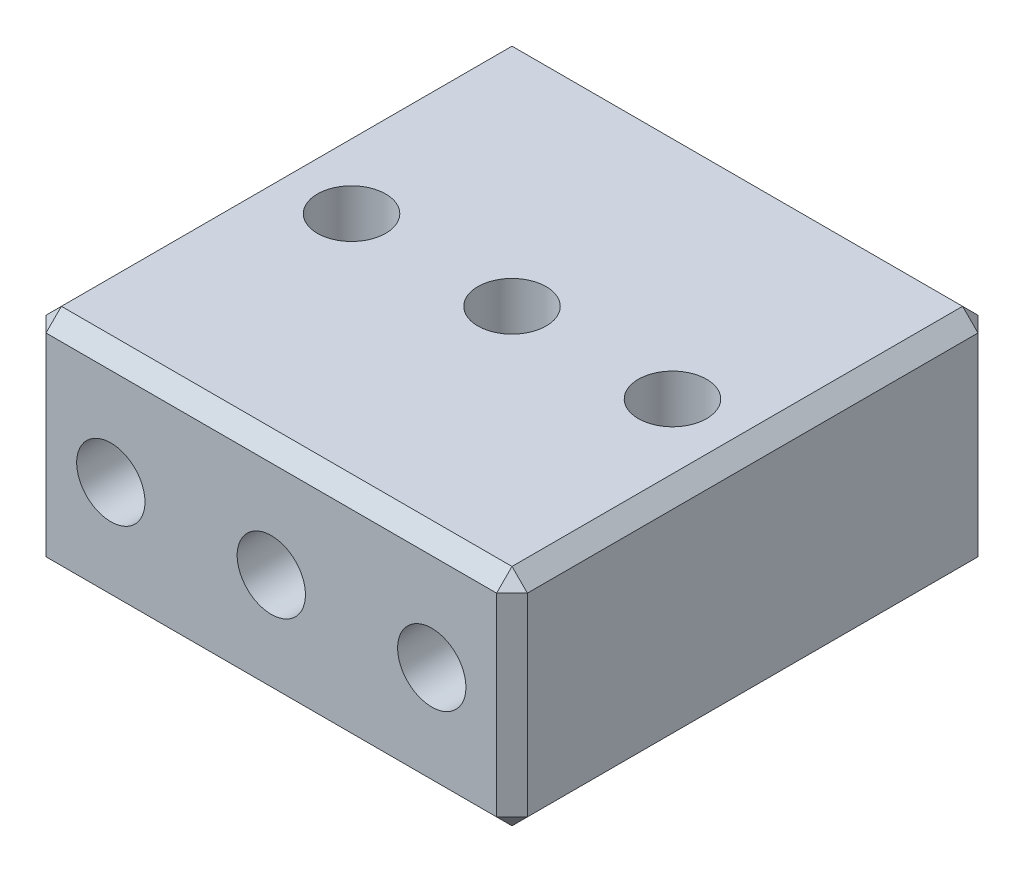
ISO-10303-21;
HEADER;
FILE_DESCRIPTION(('STEP AP214'),'2;1');
FILE_NAME('part.step','',(''),(''),'','','');
FILE_SCHEMA(('AUTOMOTIVE_DESIGN { 1 0 10303 214 1 1 1 1 }'));
ENDSEC;
DATA;
#1=APPLICATION_CONTEXT('core data for automotive mechanical design processes');
#2=APPLICATION_PROTOCOL_DEFINITION('international standard','automotive_design',2000,#1);
#3=PRODUCT_CONTEXT('',#1,'mechanical');
#4=PRODUCT('Part','Part','',(#3));
#5=PRODUCT_RELATED_PRODUCT_CATEGORY('part','',(#4));
#6=PRODUCT_DEFINITION_FORMATION('','',#4);
#7=PRODUCT_DEFINITION_CONTEXT('part definition',#1,'design');
#8=PRODUCT_DEFINITION('design','',#6,#7);
#9=PRODUCT_DEFINITION_SHAPE('','',#8);
#10=(LENGTH_UNIT() NAMED_UNIT(*) SI_UNIT(.MILLI.,.METRE.));
#11=(NAMED_UNIT(*) PLANE_ANGLE_UNIT() SI_UNIT($,.RADIAN.));
#12=(NAMED_UNIT(*) SI_UNIT($,.STERADIAN.) SOLID_ANGLE_UNIT());
#13=UNCERTAINTY_MEASURE_WITH_UNIT(LENGTH_MEASURE(1.E-05),#10,'distance_accuracy_value','');
#14=(GEOMETRIC_REPRESENTATION_CONTEXT(3) GLOBAL_UNCERTAINTY_ASSIGNED_CONTEXT((#13)) GLOBAL_UNIT_ASSIGNED_CONTEXT((#10,
#11,#12)) REPRESENTATION_CONTEXT('',''));
#15=CARTESIAN_POINT('',(0.,0.,0.));
#16=DIRECTION('',(0.,0.,1.));
#17=DIRECTION('',(1.,0.,0.));
#18=AXIS2_PLACEMENT_3D('',#15,#16,#17);
#19=CARTESIAN_POINT('',(-15.875,0.,23.8125));
#20=DIRECTION('',(0.,0.,1.));
#21=DIRECTION('',(1.,0.,0.));
#22=AXIS2_PLACEMENT_3D('',#19,#20,#21);
#23=CYLINDRICAL_SURFACE('',#22,3.3782);
#24=CARTESIAN_POINT('',(-15.875,0.,23.8125));
#25=DIRECTION('',(0.,0.,1.));
#26=DIRECTION('',(1.,0.,0.));
#27=AXIS2_PLACEMENT_3D('',#24,#25,#26);
#28=CIRCLE('',#27,3.3782);
#29=CARTESIAN_POINT('',(-12.4968,0.,23.8125));
#30=VERTEX_POINT('',#29);
#31=EDGE_CURVE('E317',#30,#30,#28,.T.);
#32=ORIENTED_EDGE('',*,*,#31,.T.);
#33=EDGE_LOOP('',(#32));
#34=FACE_BOUND('',#33,.T.);
#35=CARTESIAN_POINT('',(-15.875,0.,0.));
#36=DIRECTION('',(0.,-0.707106781186548,0.707106781186547));
#37=DIRECTION('',(0.,0.707106781186547,0.707106781186547));
#38=AXIS2_PLACEMENT_3D('',#35,#36,#37);
#39=ELLIPSE('',#38,4.77749625640878,3.37819999999999);
#40=CARTESIAN_POINT('',(-19.2532,0.,0.));
#41=VERTEX_POINT('',#40);
#42=CARTESIAN_POINT('',(-12.4968,0.,0.));
#43=VERTEX_POINT('',#42);
#44=EDGE_CURVE('E159',#41,#43,#39,.F.);
#45=ORIENTED_EDGE('',*,*,#44,.T.);
#46=CARTESIAN_POINT('',(-15.875,0.,0.));
#47=DIRECTION('',(0.,0.707106781186547,0.707106781186547));
#48=DIRECTION('',(0.,-0.707106781186548,0.707106781186547));
#49=AXIS2_PLACEMENT_3D('',#46,#47,#48);
#50=ELLIPSE('',#49,4.77749625640878,3.37819999999999);
#51=EDGE_CURVE('E155',#43,#41,#50,.F.);
#52=ORIENTED_EDGE('',*,*,#51,.T.);
#53=EDGE_LOOP('',(#45,#52));
#54=FACE_BOUND('',#53,.T.);
#55=ADVANCED_FACE('F41',(#34,#54),#23,.F.);
#56=CARTESIAN_POINT('',(15.875,0.,23.8125));
#57=DIRECTION('',(0.,0.,1.));
#58=DIRECTION('',(1.,0.,0.));
#59=AXIS2_PLACEMENT_3D('',#56,#57,#58);
#60=CYLINDRICAL_SURFACE('',#59,3.3782);
#61=CARTESIAN_POINT('',(15.875,0.,23.8125));
#62=DIRECTION('',(0.,0.,1.));
#63=DIRECTION('',(1.,0.,0.));
#64=AXIS2_PLACEMENT_3D('',#61,#62,#63);
#65=CIRCLE('',#64,3.3782);
#66=CARTESIAN_POINT('',(19.2532,0.,23.8125));
#67=VERTEX_POINT('',#66);
#68=EDGE_CURVE('E323',#67,#67,#65,.T.);
#69=ORIENTED_EDGE('',*,*,#68,.T.);
#70=EDGE_LOOP('',(#69));
#71=FACE_BOUND('',#70,.T.);
#72=CARTESIAN_POINT('',(15.875,0.,0.));
#73=DIRECTION('',(0.,-0.707106781186548,0.707106781186547));
#74=DIRECTION('',(0.,0.707106781186547,0.707106781186547));
#75=AXIS2_PLACEMENT_3D('',#72,#73,#74);
#76=ELLIPSE('',#75,4.77749625640878,3.37819999999999);
#77=CARTESIAN_POINT('',(12.4968,0.,0.));
#78=VERTEX_POINT('',#77);
#79=CARTESIAN_POINT('',(19.2532,0.,0.));
#80=VERTEX_POINT('',#79);
#81=EDGE_CURVE('E340',#78,#80,#76,.F.);
#82=ORIENTED_EDGE('',*,*,#81,.T.);
#83=CARTESIAN_POINT('',(15.875,0.,0.));
#84=DIRECTION('',(0.,0.707106781186547,0.707106781186547));
#85=DIRECTION('',(0.,-0.707106781186548,0.707106781186547));
#86=AXIS2_PLACEMENT_3D('',#83,#84,#85);
#87=ELLIPSE('',#86,4.77749625640878,3.37819999999999);
#88=EDGE_CURVE('E165',#80,#78,#87,.F.);
#89=ORIENTED_EDGE('',*,*,#88,.T.);
#90=EDGE_LOOP('',(#82,#89));
#91=FACE_BOUND('',#90,.T.);
#92=ADVANCED_FACE('F351',(#71,#91),#60,.F.);
#93=CARTESIAN_POINT('',(0.,0.,23.8125));
#94=DIRECTION('',(0.,0.,1.));
#95=DIRECTION('',(1.,0.,0.));
#96=AXIS2_PLACEMENT_3D('',#93,#94,#95);
#97=CYLINDRICAL_SURFACE('',#96,3.3782);
#98=CARTESIAN_POINT('',(0.,0.,23.8125));
#99=DIRECTION('',(0.,0.,1.));
#100=DIRECTION('',(1.,0.,0.));
#101=AXIS2_PLACEMENT_3D('',#98,#99,#100);
#102=CIRCLE('',#101,3.3782);
#103=CARTESIAN_POINT('',(3.3782,0.,23.8125));
#104=VERTEX_POINT('',#103);
#105=EDGE_CURVE('E311',#104,#104,#102,.T.);
#106=ORIENTED_EDGE('',*,*,#105,.T.);
#107=EDGE_LOOP('',(#106));
#108=FACE_BOUND('',#107,.T.);
#109=CARTESIAN_POINT('',(0.,0.,0.));
#110=DIRECTION('',(0.,-0.707106781186548,0.707106781186547));
#111=DIRECTION('',(0.,0.707106781186547,0.707106781186547));
#112=AXIS2_PLACEMENT_3D('',#109,#110,#111);
#113=ELLIPSE('',#112,4.77749625640878,3.37819999999999);
#114=CARTESIAN_POINT('',(-3.37819999999999,0.,0.));
#115=VERTEX_POINT('',#114);
#116=CARTESIAN_POINT('',(3.37819999999999,0.,0.));
#117=VERTEX_POINT('',#116);
#118=EDGE_CURVE('E329',#115,#117,#113,.F.);
#119=ORIENTED_EDGE('',*,*,#118,.T.);
#120=CARTESIAN_POINT('',(0.,0.,0.));
#121=DIRECTION('',(0.,0.707106781186547,0.707106781186547));
#122=DIRECTION('',(0.,-0.707106781186548,0.707106781186547));
#123=AXIS2_PLACEMENT_3D('',#120,#121,#122);
#124=ELLIPSE('',#123,4.77749625640878,3.37819999999999);
#125=EDGE_CURVE('E337',#117,#115,#124,.F.);
#126=ORIENTED_EDGE('',*,*,#125,.T.);
#127=EDGE_LOOP('',(#119,#126));
#128=FACE_BOUND('',#127,.T.);
#129=ADVANCED_FACE('F380',(#108,#128),#97,.F.);
#130=CARTESIAN_POINT('',(23.8125,-11.1125,23.8125));
#131=DIRECTION('',(0.,0.,-1.));
#132=DIRECTION('',(-1.,0.,0.));
#133=AXIS2_PLACEMENT_3D('',#130,#131,#132);
#134=PLANE('',#133);
#135=DIRECTION('',(-1.,0.,0.));
#136=VECTOR('',#135,1.);
#137=CARTESIAN_POINT('',(23.8125,9.5885,23.8125));
#138=LINE('',#137,#136);
#139=CARTESIAN_POINT('',(22.2885,9.5885,23.8125));
#140=VERTEX_POINT('',#139);
#141=CARTESIAN_POINT('',(-22.2885,9.5885,23.8125));
#142=VERTEX_POINT('',#141);
#143=EDGE_CURVE('E208',#140,#142,#138,.T.);
#144=ORIENTED_EDGE('',*,*,#143,.T.);
#145=DIRECTION('',(0.,-1.,0.));
#146=VECTOR('',#145,1.);
#147=CARTESIAN_POINT('',(-22.2885,-11.1125,23.8125));
#148=LINE('',#147,#146);
#149=CARTESIAN_POINT('',(-22.2885,-9.58850000000001,23.8125));
#150=VERTEX_POINT('',#149);
#151=EDGE_CURVE('E214',#142,#150,#148,.T.);
#152=ORIENTED_EDGE('',*,*,#151,.T.);
#153=DIRECTION('',(1.,0.,0.));
#154=VECTOR('',#153,1.);
#155=CARTESIAN_POINT('',(23.8125,-9.58850000000001,23.8125));
#156=LINE('',#155,#154);
#157=CARTESIAN_POINT('',(22.2885,-9.58850000000001,23.8125));
#158=VERTEX_POINT('',#157);
#159=EDGE_CURVE('E212',#150,#158,#156,.T.);
#160=ORIENTED_EDGE('',*,*,#159,.T.);
#161=DIRECTION('',(0.,1.,0.));
#162=VECTOR('',#161,1.);
#163=CARTESIAN_POINT('',(22.2885,11.1125,23.8125));
#164=LINE('',#163,#162);
#165=EDGE_CURVE('E210',#158,#140,#164,.T.);
#166=ORIENTED_EDGE('',*,*,#165,.T.);
#167=EDGE_LOOP('',(#144,#152,#160,#166));
#168=FACE_BOUND('',#167,.T.);
#169=ORIENTED_EDGE('',*,*,#105,.F.);
#170=EDGE_LOOP('',(#169));
#171=FACE_BOUND('',#170,.T.);
#172=ORIENTED_EDGE('',*,*,#31,.F.);
#173=EDGE_LOOP('',(#172));
#174=FACE_BOUND('',#173,.T.);
#175=ORIENTED_EDGE('',*,*,#68,.F.);
#176=EDGE_LOOP('',(#175));
#177=FACE_BOUND('',#176,.T.);
#178=ADVANCED_FACE('F412',(#168,#171,#174,#177),#134,.F.);
#179=CARTESIAN_POINT('',(23.8125,-11.1125,-23.8125));
#180=DIRECTION('',(0.,1.,0.));
#181=DIRECTION('',(0.,0.,1.));
#182=AXIS2_PLACEMENT_3D('',#179,#180,#181);
#183=PLANE('',#182);
#184=DIRECTION('',(-1.,0.,0.));
#185=VECTOR('',#184,1.);
#186=CARTESIAN_POINT('',(23.8125,-11.1125,22.2885));
#187=LINE('',#186,#185);
#188=CARTESIAN_POINT('',(22.2885,-11.1125,22.2885));
#189=VERTEX_POINT('',#188);
#190=CARTESIAN_POINT('',(-22.2885,-11.1125,22.2885));
#191=VERTEX_POINT('',#190);
#192=EDGE_CURVE('E174',#189,#191,#187,.T.);
#193=ORIENTED_EDGE('',*,*,#192,.T.);
#194=DIRECTION('',(0.,0.,-1.));
#195=VECTOR('',#194,1.);
#196=CARTESIAN_POINT('',(-22.2885,-11.1125,-23.8125));
#197=LINE('',#196,#195);
#198=CARTESIAN_POINT('',(-22.2885,-11.1125,-22.2885));
#199=VERTEX_POINT('',#198);
#200=EDGE_CURVE('E178',#191,#199,#197,.T.);
#201=ORIENTED_EDGE('',*,*,#200,.T.);
#202=DIRECTION('',(1.,0.,0.));
#203=VECTOR('',#202,1.);
#204=CARTESIAN_POINT('',(23.8125,-11.1125,-22.2885));
#205=LINE('',#204,#203);
#206=CARTESIAN_POINT('',(22.2885,-11.1125,-22.2885));
#207=VERTEX_POINT('',#206);
#208=EDGE_CURVE('E176',#199,#207,#205,.T.);
#209=ORIENTED_EDGE('',*,*,#208,.T.);
#210=DIRECTION('',(0.,0.,1.));
#211=VECTOR('',#210,1.);
#212=CARTESIAN_POINT('',(22.2885,-11.1125,23.8125));
#213=LINE('',#212,#211);
#214=EDGE_CURVE('E167',#207,#189,#213,.T.);
#215=ORIENTED_EDGE('',*,*,#214,.T.);
#216=EDGE_LOOP('',(#193,#201,#209,#215));
#217=FACE_BOUND('',#216,.T.);
#218=CARTESIAN_POINT('',(-15.875,-11.1125,0.));
#219=DIRECTION('',(0.,1.,0.));
#220=DIRECTION('',(0.,0.,1.));
#221=AXIS2_PLACEMENT_3D('',#218,#219,#220);
#222=CIRCLE('',#221,3.3782);
#223=CARTESIAN_POINT('',(-15.875,-11.1125,3.3782));
#224=VERTEX_POINT('',#223);
#225=EDGE_CURVE('E292',#224,#224,#222,.T.);
#226=ORIENTED_EDGE('',*,*,#225,.T.);
#227=EDGE_LOOP('',(#226));
#228=FACE_BOUND('',#227,.T.);
#229=CARTESIAN_POINT('',(15.875,-11.1125,0.));
#230=DIRECTION('',(0.,1.,0.));
#231=DIRECTION('',(0.,0.,1.));
#232=AXIS2_PLACEMENT_3D('',#229,#230,#231);
#233=CIRCLE('',#232,3.3782);
#234=CARTESIAN_POINT('',(15.875,-11.1125,3.3782));
#235=VERTEX_POINT('',#234);
#236=EDGE_CURVE('E302',#235,#235,#233,.T.);
#237=ORIENTED_EDGE('',*,*,#236,.T.);
#238=EDGE_LOOP('',(#237));
#239=FACE_BOUND('',#238,.T.);
#240=CARTESIAN_POINT('',(0.,-11.1125,0.));
#241=DIRECTION('',(0.,1.,0.));
#242=DIRECTION('',(0.,0.,1.));
#243=AXIS2_PLACEMENT_3D('',#240,#241,#242);
#244=CIRCLE('',#243,3.3782);
#245=CARTESIAN_POINT('',(0.,-11.1125,3.3782));
#246=VERTEX_POINT('',#245);
#247=EDGE_CURVE('E308',#246,#246,#244,.T.);
#248=ORIENTED_EDGE('',*,*,#247,.T.);
#249=EDGE_LOOP('',(#248));
#250=FACE_BOUND('',#249,.T.);
#251=ADVANCED_FACE('F408',(#217,#228,#239,#250),#183,.F.);
#252=CARTESIAN_POINT('',(23.8125,-11.1125,-23.8125));
#253=DIRECTION('',(0.,0.,1.));
#254=DIRECTION('',(1.,0.,0.));
#255=AXIS2_PLACEMENT_3D('',#252,#253,#254);
#256=PLANE('',#255);
#257=DIRECTION('',(0.,-1.,0.));
#258=VECTOR('',#257,1.);
#259=CARTESIAN_POINT('',(22.2885,-11.1125,-23.8125));
#260=LINE('',#259,#258);
#261=CARTESIAN_POINT('',(22.2885,9.58850000000001,-23.8125));
#262=VERTEX_POINT('',#261);
#263=CARTESIAN_POINT('',(22.2885,-9.58850000000001,-23.8125));
#264=VERTEX_POINT('',#263);
#265=EDGE_CURVE('E190',#262,#264,#260,.T.);
#266=ORIENTED_EDGE('',*,*,#265,.T.);
#267=DIRECTION('',(-1.,0.,0.));
#268=VECTOR('',#267,1.);
#269=CARTESIAN_POINT('',(23.8125,-9.58850000000001,-23.8125));
#270=LINE('',#269,#268);
#271=CARTESIAN_POINT('',(-22.2885,-9.58850000000001,-23.8125));
#272=VERTEX_POINT('',#271);
#273=EDGE_CURVE('E196',#264,#272,#270,.T.);
#274=ORIENTED_EDGE('',*,*,#273,.T.);
#275=DIRECTION('',(0.,1.,0.));
#276=VECTOR('',#275,1.);
#277=CARTESIAN_POINT('',(-22.2885,-11.1125,-23.8125));
#278=LINE('',#277,#276);
#279=CARTESIAN_POINT('',(-22.2885,9.58850000000001,-23.8125));
#280=VERTEX_POINT('',#279);
#281=EDGE_CURVE('E194',#272,#280,#278,.T.);
#282=ORIENTED_EDGE('',*,*,#281,.T.);
#283=DIRECTION('',(1.,0.,0.));
#284=VECTOR('',#283,1.);
#285=CARTESIAN_POINT('',(23.8125,9.58850000000001,-23.8125));
#286=LINE('',#285,#284);
#287=EDGE_CURVE('E192',#280,#262,#286,.T.);
#288=ORIENTED_EDGE('',*,*,#287,.T.);
#289=EDGE_LOOP('',(#266,#274,#282,#288));
#290=FACE_BOUND('',#289,.T.);
#291=CARTESIAN_POINT('',(0.,0.,-23.8125));
#292=DIRECTION('',(0.,0.,1.));
#293=DIRECTION('',(1.,0.,0.));
#294=AXIS2_PLACEMENT_3D('',#291,#292,#293);
#295=CIRCLE('',#294,3.37819999999999);
#296=CARTESIAN_POINT('',(3.37819999999999,0.,-23.8125));
#297=VERTEX_POINT('',#296);
#298=EDGE_CURVE('E314',#297,#297,#295,.T.);
#299=ORIENTED_EDGE('',*,*,#298,.T.);
#300=EDGE_LOOP('',(#299));
#301=FACE_BOUND('',#300,.T.);
#302=CARTESIAN_POINT('',(-15.875,0.,-23.8125));
#303=DIRECTION('',(0.,0.,1.));
#304=DIRECTION('',(1.,0.,0.));
#305=AXIS2_PLACEMENT_3D('',#302,#303,#304);
#306=CIRCLE('',#305,3.37819999999999);
#307=CARTESIAN_POINT('',(-12.4968,0.,-23.8125));
#308=VERTEX_POINT('',#307);
#309=EDGE_CURVE('E320',#308,#308,#306,.T.);
#310=ORIENTED_EDGE('',*,*,#309,.T.);
#311=EDGE_LOOP('',(#310));
#312=FACE_BOUND('',#311,.T.);
#313=CARTESIAN_POINT('',(15.875,0.,-23.8125));
#314=DIRECTION('',(0.,0.,1.));
#315=DIRECTION('',(1.,0.,0.));
#316=AXIS2_PLACEMENT_3D('',#313,#314,#315);
#317=CIRCLE('',#316,3.37819999999999);
#318=CARTESIAN_POINT('',(19.2532,0.,-23.8125));
#319=VERTEX_POINT('',#318);
#320=EDGE_CURVE('E326',#319,#319,#317,.T.);
#321=ORIENTED_EDGE('',*,*,#320,.T.);
#322=EDGE_LOOP('',(#321));
#323=FACE_BOUND('',#322,.T.);
#324=ADVANCED_FACE('F404',(#290,#301,#312,#323),#256,.F.);
#325=CARTESIAN_POINT('',(23.8125,11.1125,-23.8125));
#326=DIRECTION('',(0.,-1.,0.));
#327=DIRECTION('',(0.,0.,-1.));
#328=AXIS2_PLACEMENT_3D('',#325,#326,#327);
#329=PLANE('',#328);
#330=DIRECTION('',(0.,0.,-1.));
#331=VECTOR('',#330,1.);
#332=CARTESIAN_POINT('',(22.2885,11.1125,-23.8125));
#333=LINE('',#332,#331);
#334=CARTESIAN_POINT('',(22.2885,11.1125,22.2885));
#335=VERTEX_POINT('',#334);
#336=CARTESIAN_POINT('',(22.2885,11.1125,-22.2885));
#337=VERTEX_POINT('',#336);
#338=EDGE_CURVE('E201',#335,#337,#333,.T.);
#339=ORIENTED_EDGE('',*,*,#338,.T.);
#340=DIRECTION('',(-1.,0.,0.));
#341=VECTOR('',#340,1.);
#342=CARTESIAN_POINT('',(23.8125,11.1125,-22.2885));
#343=LINE('',#342,#341);
#344=CARTESIAN_POINT('',(-22.2885,11.1125,-22.2885));
#345=VERTEX_POINT('',#344);
#346=EDGE_CURVE('E205',#337,#345,#343,.T.);
#347=ORIENTED_EDGE('',*,*,#346,.T.);
#348=DIRECTION('',(0.,0.,1.));
#349=VECTOR('',#348,1.);
#350=CARTESIAN_POINT('',(-22.2885,11.1125,-23.8125));
#351=LINE('',#350,#349);
#352=CARTESIAN_POINT('',(-22.2885,11.1125,22.2885));
#353=VERTEX_POINT('',#352);
#354=EDGE_CURVE('E203',#345,#353,#351,.T.);
#355=ORIENTED_EDGE('',*,*,#354,.T.);
#356=DIRECTION('',(1.,0.,0.));
#357=VECTOR('',#356,1.);
#358=CARTESIAN_POINT('',(23.8125,11.1125,22.2885));
#359=LINE('',#358,#357);
#360=EDGE_CURVE('E199',#353,#335,#359,.T.);
#361=ORIENTED_EDGE('',*,*,#360,.T.);
#362=EDGE_LOOP('',(#339,#347,#355,#361));
#363=FACE_BOUND('',#362,.T.);
#364=CARTESIAN_POINT('',(-15.875,11.1125,0.));
#365=DIRECTION('',(0.,1.,0.));
#366=DIRECTION('',(0.,0.,1.));
#367=AXIS2_PLACEMENT_3D('',#364,#365,#366);
#368=CIRCLE('',#367,3.37819999999999);
#369=CARTESIAN_POINT('',(-15.875,11.1125,3.37819999999999));
#370=VERTEX_POINT('',#369);
#371=EDGE_CURVE('E286',#370,#370,#368,.T.);
#372=ORIENTED_EDGE('',*,*,#371,.F.);
#373=EDGE_LOOP('',(#372));
#374=FACE_BOUND('',#373,.T.);
#375=CARTESIAN_POINT('',(15.875,11.1125,0.));
#376=DIRECTION('',(0.,1.,0.));
#377=DIRECTION('',(0.,0.,1.));
#378=AXIS2_PLACEMENT_3D('',#375,#376,#377);
#379=CIRCLE('',#378,3.37819999999999);
#380=CARTESIAN_POINT('',(15.875,11.1125,3.37819999999999));
#381=VERTEX_POINT('',#380);
#382=EDGE_CURVE('E297',#381,#381,#379,.T.);
#383=ORIENTED_EDGE('',*,*,#382,.F.);
#384=EDGE_LOOP('',(#383));
#385=FACE_BOUND('',#384,.T.);
#386=CARTESIAN_POINT('',(0.,11.1125,0.));
#387=DIRECTION('',(0.,1.,0.));
#388=DIRECTION('',(0.,0.,1.));
#389=AXIS2_PLACEMENT_3D('',#386,#387,#388);
#390=CIRCLE('',#389,3.37819999999999);
#391=CARTESIAN_POINT('',(0.,11.1125,3.37819999999999));
#392=VERTEX_POINT('',#391);
#393=EDGE_CURVE('E305',#392,#392,#390,.T.);
#394=ORIENTED_EDGE('',*,*,#393,.F.);
#395=EDGE_LOOP('',(#394));
#396=FACE_BOUND('',#395,.T.);
#397=ADVANCED_FACE('F400',(#363,#374,#385,#396),#329,.F.);
#398=CARTESIAN_POINT('',(23.8125,0.,0.));
#399=DIRECTION('',(1.,0.,0.));
#400=DIRECTION('',(0.,0.,-1.));
#401=AXIS2_PLACEMENT_3D('',#398,#399,#400);
#402=PLANE('',#401);
#403=DIRECTION('',(0.,0.,-1.));
#404=VECTOR('',#403,1.);
#405=CARTESIAN_POINT('',(23.8125,-9.58850000000001,-23.8125));
#406=LINE('',#405,#404);
#407=CARTESIAN_POINT('',(23.8125,-9.58850000000001,22.2885));
#408=VERTEX_POINT('',#407);
#409=CARTESIAN_POINT('',(23.8125,-9.58850000000001,-22.2885));
#410=VERTEX_POINT('',#409);
#411=EDGE_CURVE('E51',#408,#410,#406,.T.);
#412=ORIENTED_EDGE('',*,*,#411,.T.);
#413=DIRECTION('',(0.,1.,0.));
#414=VECTOR('',#413,1.);
#415=CARTESIAN_POINT('',(23.8125,11.1125,-22.2885));
#416=LINE('',#415,#414);
#417=CARTESIAN_POINT('',(23.8125,9.58850000000001,-22.2885));
#418=VERTEX_POINT('',#417);
#419=EDGE_CURVE('E11',#410,#418,#416,.T.);
#420=ORIENTED_EDGE('',*,*,#419,.T.);
#421=DIRECTION('',(0.,0.,1.));
#422=VECTOR('',#421,1.);
#423=CARTESIAN_POINT('',(23.8125,9.58850000000001,23.8125));
#424=LINE('',#423,#422);
#425=CARTESIAN_POINT('',(23.8125,9.58850000000001,22.2885));
#426=VERTEX_POINT('',#425);
#427=EDGE_CURVE('E219',#418,#426,#424,.T.);
#428=ORIENTED_EDGE('',*,*,#427,.T.);
#429=DIRECTION('',(0.,-1.,0.));
#430=VECTOR('',#429,1.);
#431=CARTESIAN_POINT('',(23.8125,-11.1125,22.2885));
#432=LINE('',#431,#430);
#433=EDGE_CURVE('E217',#426,#408,#432,.T.);
#434=ORIENTED_EDGE('',*,*,#433,.T.);
#435=EDGE_LOOP('',(#412,#420,#428,#434));
#436=FACE_BOUND('',#435,.T.);
#437=ADVANCED_FACE('F395',(#436),#402,.T.);
#438=CARTESIAN_POINT('',(-23.8125,0.,0.));
#439=DIRECTION('',(1.,0.,0.));
#440=DIRECTION('',(0.,0.,-1.));
#441=AXIS2_PLACEMENT_3D('',#438,#439,#440);
#442=PLANE('',#441);
#443=DIRECTION('',(0.,-1.,0.));
#444=VECTOR('',#443,1.);
#445=CARTESIAN_POINT('',(-23.8125,0.,-22.2885));
#446=LINE('',#445,#444);
#447=CARTESIAN_POINT('',(-23.8125,9.58850000000001,-22.2885));
#448=VERTEX_POINT('',#447);
#449=CARTESIAN_POINT('',(-23.8125,-9.5885,-22.2885));
#450=VERTEX_POINT('',#449);
#451=EDGE_CURVE('E185',#448,#450,#446,.T.);
#452=ORIENTED_EDGE('',*,*,#451,.T.);
#453=DIRECTION('',(0.,0.,1.));
#454=VECTOR('',#453,1.);
#455=CARTESIAN_POINT('',(-23.8125,-9.5885,0.));
#456=LINE('',#455,#454);
#457=CARTESIAN_POINT('',(-23.8125,-9.5885,22.2885));
#458=VERTEX_POINT('',#457);
#459=EDGE_CURVE('E187',#450,#458,#456,.T.);
#460=ORIENTED_EDGE('',*,*,#459,.T.);
#461=DIRECTION('',(0.,1.,0.));
#462=VECTOR('',#461,1.);
#463=CARTESIAN_POINT('',(-23.8125,0.,22.2885));
#464=LINE('',#463,#462);
#465=CARTESIAN_POINT('',(-23.8125,9.58850000000001,22.2885));
#466=VERTEX_POINT('',#465);
#467=EDGE_CURVE('E181',#458,#466,#464,.T.);
#468=ORIENTED_EDGE('',*,*,#467,.T.);
#469=DIRECTION('',(0.,0.,-1.));
#470=VECTOR('',#469,1.);
#471=CARTESIAN_POINT('',(-23.8125,9.58850000000001,0.));
#472=LINE('',#471,#470);
#473=EDGE_CURVE('E183',#466,#448,#472,.T.);
#474=ORIENTED_EDGE('',*,*,#473,.T.);
#475=EDGE_LOOP('',(#452,#460,#468,#474));
#476=FACE_BOUND('',#475,.T.);
#477=ADVANCED_FACE('F391',(#476),#442,.F.);
#478=CARTESIAN_POINT('',(15.875,0.,0.));
#479=DIRECTION('',(0.,-0.707106781186548,0.707106781186547));
#480=DIRECTION('',(0.,0.707106781186547,0.707106781186547));
#481=AXIS2_PLACEMENT_3D('',#478,#479,#480);
#482=ELLIPSE('',#481,4.77749625640878,3.37819999999999);
#483=EDGE_CURVE('E342',#78,#80,#482,.T.);
#484=ORIENTED_EDGE('',*,*,#483,.T.);
#485=CARTESIAN_POINT('',(15.875,0.,0.));
#486=DIRECTION('',(0.,0.707106781186547,0.707106781186547));
#487=DIRECTION('',(0.,-0.707106781186548,0.707106781186547));
#488=AXIS2_PLACEMENT_3D('',#485,#486,#487);
#489=ELLIPSE('',#488,4.77749625640878,3.37819999999999);
#490=EDGE_CURVE('E345',#80,#78,#489,.T.);
#491=ORIENTED_EDGE('',*,*,#490,.T.);
#492=EDGE_LOOP('',(#484,#491));
#493=FACE_BOUND('',#492,.T.);
#494=ORIENTED_EDGE('',*,*,#320,.F.);
#495=EDGE_LOOP('',(#494));
#496=FACE_BOUND('',#495,.T.);
#497=ADVANCED_FACE('F356',(#493,#496),#60,.F.);
#498=CARTESIAN_POINT('',(-15.875,0.,0.));
#499=DIRECTION('',(0.,-0.707106781186548,0.707106781186547));
#500=DIRECTION('',(0.,0.707106781186547,0.707106781186547));
#501=AXIS2_PLACEMENT_3D('',#498,#499,#500);
#502=ELLIPSE('',#501,4.77749625640878,3.37819999999999);
#503=EDGE_CURVE('E151',#41,#43,#502,.T.);
#504=ORIENTED_EDGE('',*,*,#503,.T.);
#505=CARTESIAN_POINT('',(-15.875,0.,0.));
#506=DIRECTION('',(0.,0.707106781186547,0.707106781186547));
#507=DIRECTION('',(0.,-0.707106781186548,0.707106781186547));
#508=AXIS2_PLACEMENT_3D('',#505,#506,#507);
#509=ELLIPSE('',#508,4.77749625640878,3.37819999999999);
#510=EDGE_CURVE('E158',#43,#41,#509,.T.);
#511=ORIENTED_EDGE('',*,*,#510,.T.);
#512=EDGE_LOOP('',(#504,#511));
#513=FACE_BOUND('',#512,.T.);
#514=ORIENTED_EDGE('',*,*,#309,.F.);
#515=EDGE_LOOP('',(#514));
#516=FACE_BOUND('',#515,.T.);
#517=ADVANCED_FACE('F169',(#513,#516),#23,.F.);
#518=CARTESIAN_POINT('',(0.,0.,0.));
#519=DIRECTION('',(0.,-0.707106781186548,0.707106781186547));
#520=DIRECTION('',(0.,0.707106781186547,0.707106781186547));
#521=AXIS2_PLACEMENT_3D('',#518,#519,#520);
#522=ELLIPSE('',#521,4.77749625640878,3.37819999999999);
#523=EDGE_CURVE('E331',#115,#117,#522,.T.);
#524=ORIENTED_EDGE('',*,*,#523,.T.);
#525=CARTESIAN_POINT('',(0.,0.,0.));
#526=DIRECTION('',(0.,0.707106781186547,0.707106781186547));
#527=DIRECTION('',(0.,-0.707106781186548,0.707106781186547));
#528=AXIS2_PLACEMENT_3D('',#525,#526,#527);
#529=ELLIPSE('',#528,4.77749625640878,3.37819999999999);
#530=EDGE_CURVE('E334',#117,#115,#529,.T.);
#531=ORIENTED_EDGE('',*,*,#530,.T.);
#532=EDGE_LOOP('',(#524,#531));
#533=FACE_BOUND('',#532,.T.);
#534=ORIENTED_EDGE('',*,*,#298,.F.);
#535=EDGE_LOOP('',(#534));
#536=FACE_BOUND('',#535,.T.);
#537=ADVANCED_FACE('F385',(#533,#536),#97,.F.);
#538=CARTESIAN_POINT('',(0.,11.1125,0.));
#539=DIRECTION('',(0.,1.,0.));
#540=DIRECTION('',(0.,0.,1.));
#541=AXIS2_PLACEMENT_3D('',#538,#539,#540);
#542=CYLINDRICAL_SURFACE('',#541,3.37819999999999);
#543=ORIENTED_EDGE('',*,*,#393,.T.);
#544=EDGE_LOOP('',(#543));
#545=FACE_BOUND('',#544,.T.);
#546=ORIENTED_EDGE('',*,*,#118,.F.);
#547=ORIENTED_EDGE('',*,*,#530,.F.);
#548=EDGE_LOOP('',(#546,#547));
#549=FACE_BOUND('',#548,.T.);
#550=ADVANCED_FACE('F370',(#545,#549),#542,.F.);
#551=ORIENTED_EDGE('',*,*,#247,.F.);
#552=EDGE_LOOP('',(#551));
#553=FACE_BOUND('',#552,.T.);
#554=ORIENTED_EDGE('',*,*,#523,.F.);
#555=ORIENTED_EDGE('',*,*,#125,.F.);
#556=EDGE_LOOP('',(#554,#555));
#557=FACE_BOUND('',#556,.T.);
#558=ADVANCED_FACE('F362',(#553,#557),#542,.F.);
#559=CARTESIAN_POINT('',(15.875,11.1125,0.));
#560=DIRECTION('',(0.,1.,0.));
#561=DIRECTION('',(0.,0.,1.));
#562=AXIS2_PLACEMENT_3D('',#559,#560,#561);
#563=CYLINDRICAL_SURFACE('',#562,3.37819999999999);
#564=ORIENTED_EDGE('',*,*,#382,.T.);
#565=EDGE_LOOP('',(#564));
#566=FACE_BOUND('',#565,.T.);
#567=ORIENTED_EDGE('',*,*,#81,.F.);
#568=ORIENTED_EDGE('',*,*,#490,.F.);
#569=EDGE_LOOP('',(#567,#568));
#570=FACE_BOUND('',#569,.T.);
#571=ADVANCED_FACE('F359',(#566,#570),#563,.F.);
#572=ORIENTED_EDGE('',*,*,#236,.F.);
#573=EDGE_LOOP('',(#572));
#574=FACE_BOUND('',#573,.T.);
#575=ORIENTED_EDGE('',*,*,#483,.F.);
#576=ORIENTED_EDGE('',*,*,#88,.F.);
#577=EDGE_LOOP('',(#575,#576));
#578=FACE_BOUND('',#577,.T.);
#579=ADVANCED_FACE('F361',(#574,#578),#563,.F.);
#580=CARTESIAN_POINT('',(-15.875,11.1125,0.));
#581=DIRECTION('',(0.,1.,0.));
#582=DIRECTION('',(0.,0.,1.));
#583=AXIS2_PLACEMENT_3D('',#580,#581,#582);
#584=CYLINDRICAL_SURFACE('',#583,3.37819999999999);
#585=ORIENTED_EDGE('',*,*,#371,.T.);
#586=EDGE_LOOP('',(#585));
#587=FACE_BOUND('',#586,.T.);
#588=ORIENTED_EDGE('',*,*,#44,.F.);
#589=ORIENTED_EDGE('',*,*,#510,.F.);
#590=EDGE_LOOP('',(#588,#589));
#591=FACE_BOUND('',#590,.T.);
#592=ADVANCED_FACE('F163',(#587,#591),#584,.F.);
#593=ORIENTED_EDGE('',*,*,#225,.F.);
#594=EDGE_LOOP('',(#593));
#595=FACE_BOUND('',#594,.T.);
#596=ORIENTED_EDGE('',*,*,#503,.F.);
#597=ORIENTED_EDGE('',*,*,#51,.F.);
#598=EDGE_LOOP('',(#596,#597));
#599=FACE_BOUND('',#598,.T.);
#600=ADVANCED_FACE('F153',(#595,#599),#584,.F.);
#601=CARTESIAN_POINT('',(23.8125,9.58850000000001,0.));
#602=DIRECTION('',(0.707106781186546,0.707106781186549,0.));
#603=DIRECTION('',(0.,0.,-1.));
#604=AXIS2_PLACEMENT_3D('',#601,#602,#603);
#605=PLANE('',#604);
#606=DIRECTION('',(-0.707106781186549,0.707106781186546,0.));
#607=VECTOR('',#606,1.);
#608=CARTESIAN_POINT('',(23.8125,9.58850000000001,22.2885));
#609=LINE('',#608,#607);
#610=EDGE_CURVE('E46',#426,#335,#609,.T.);
#611=ORIENTED_EDGE('',*,*,#610,.F.);
#612=ORIENTED_EDGE('',*,*,#427,.F.);
#613=DIRECTION('',(0.707106781186549,-0.707106781186546,0.));
#614=VECTOR('',#613,1.);
#615=CARTESIAN_POINT('',(23.0505,10.3505,-22.2885));
#616=LINE('',#615,#614);
#617=EDGE_CURVE('E280',#337,#418,#616,.T.);
#618=ORIENTED_EDGE('',*,*,#617,.F.);
#619=ORIENTED_EDGE('',*,*,#338,.F.);
#620=EDGE_LOOP('',(#611,#612,#618,#619));
#621=FACE_BOUND('',#620,.T.);
#622=ADVANCED_FACE('F44',(#621),#605,.T.);
#623=CARTESIAN_POINT('',(23.8125,9.58850000000001,22.2885));
#624=DIRECTION('',(0.577350269189625,0.577350269189628,0.577350269189624));
#625=DIRECTION('',(-0.707106781186549,0.707106781186546,0.));
#626=AXIS2_PLACEMENT_3D('',#623,#624,#625);
#627=PLANE('',#626);
#628=DIRECTION('',(0.707106781186546,0.,-0.707106781186549));
#629=VECTOR('',#628,1.);
#630=CARTESIAN_POINT('',(23.8125,9.58850000000001,22.2885));
#631=LINE('',#630,#629);
#632=EDGE_CURVE('E275',#426,#140,#631,.F.);
#633=ORIENTED_EDGE('',*,*,#632,.F.);
#634=ORIENTED_EDGE('',*,*,#610,.T.);
#635=DIRECTION('',(0.,0.707106781186547,-0.707106781186548));
#636=VECTOR('',#635,1.);
#637=CARTESIAN_POINT('',(22.2885,10.3505,23.0505));
#638=LINE('',#637,#636);
#639=EDGE_CURVE('E278',#140,#335,#638,.T.);
#640=ORIENTED_EDGE('',*,*,#639,.F.);
#641=EDGE_LOOP('',(#633,#634,#640));
#642=FACE_BOUND('',#641,.T.);
#643=ADVANCED_FACE('F541',(#642),#627,.T.);
#644=CARTESIAN_POINT('',(22.2885,9.58850000000001,-23.8125));
#645=DIRECTION('',(0.577350269189623,0.577350269189628,-0.577350269189626));
#646=DIRECTION('',(0.,0.707106781186546,0.707106781186549));
#647=AXIS2_PLACEMENT_3D('',#644,#645,#646);
#648=PLANE('',#647);
#649=DIRECTION('',(0.,-0.707106781186546,-0.707106781186549));
#650=VECTOR('',#649,1.);
#651=CARTESIAN_POINT('',(22.2885,9.58850000000001,-23.8125));
#652=LINE('',#651,#650);
#653=EDGE_CURVE('E271',#337,#262,#652,.T.);
#654=ORIENTED_EDGE('',*,*,#653,.F.);
#655=ORIENTED_EDGE('',*,*,#617,.T.);
#656=DIRECTION('',(-0.707106781186549,0.,-0.707106781186546));
#657=VECTOR('',#656,1.);
#658=CARTESIAN_POINT('',(22.2885,9.58850000000001,-23.8125));
#659=LINE('',#658,#657);
#660=EDGE_CURVE('E64',#262,#418,#659,.F.);
#661=ORIENTED_EDGE('',*,*,#660,.F.);
#662=EDGE_LOOP('',(#654,#655,#661));
#663=FACE_BOUND('',#662,.T.);
#664=ADVANCED_FACE('F535',(#663),#648,.T.);
#665=CARTESIAN_POINT('',(23.8125,9.5885,23.8125));
#666=DIRECTION('',(0.,-0.707106781186548,-0.707106781186547));
#667=DIRECTION('',(-1.,0.,0.));
#668=AXIS2_PLACEMENT_3D('',#665,#666,#667);
#669=PLANE('',#668);
#670=ORIENTED_EDGE('',*,*,#639,.T.);
#671=ORIENTED_EDGE('',*,*,#360,.F.);
#672=DIRECTION('',(0.,-0.707106781186547,0.707106781186548));
#673=VECTOR('',#672,1.);
#674=CARTESIAN_POINT('',(-22.2885,11.1125,22.2885));
#675=LINE('',#674,#673);
#676=EDGE_CURVE('E265',#142,#353,#675,.F.);
#677=ORIENTED_EDGE('',*,*,#676,.F.);
#678=ORIENTED_EDGE('',*,*,#143,.F.);
#679=EDGE_LOOP('',(#670,#671,#677,#678));
#680=FACE_BOUND('',#679,.T.);
#681=ADVANCED_FACE('F528',(#680),#669,.F.);
#682=CARTESIAN_POINT('',(23.8125,0.,22.2885));
#683=DIRECTION('',(0.707106781186549,0.,0.707106781186546));
#684=DIRECTION('',(0.,1.,0.));
#685=AXIS2_PLACEMENT_3D('',#682,#683,#684);
#686=PLANE('',#685);
#687=ORIENTED_EDGE('',*,*,#632,.T.);
#688=ORIENTED_EDGE('',*,*,#165,.F.);
#689=DIRECTION('',(-0.707106781186546,0.,0.707106781186549));
#690=VECTOR('',#689,1.);
#691=CARTESIAN_POINT('',(22.2885,-9.58850000000001,23.8125));
#692=LINE('',#691,#690);
#693=EDGE_CURVE('E262',#408,#158,#692,.T.);
#694=ORIENTED_EDGE('',*,*,#693,.F.);
#695=ORIENTED_EDGE('',*,*,#433,.F.);
#696=EDGE_LOOP('',(#687,#688,#694,#695));
#697=FACE_BOUND('',#696,.T.);
#698=ADVANCED_FACE('F521',(#697),#686,.T.);
#699=CARTESIAN_POINT('',(23.8125,-9.58850000000001,0.));
#700=DIRECTION('',(0.707106781186546,-0.707106781186549,0.));
#701=DIRECTION('',(0.,0.,1.));
#702=AXIS2_PLACEMENT_3D('',#699,#700,#701);
#703=PLANE('',#702);
#704=DIRECTION('',(-0.707106781186549,-0.707106781186546,0.));
#705=VECTOR('',#704,1.);
#706=CARTESIAN_POINT('',(22.2885,-11.1125,-22.2885));
#707=LINE('',#706,#705);
#708=EDGE_CURVE('E256',#410,#207,#707,.T.);
#709=ORIENTED_EDGE('',*,*,#708,.F.);
#710=ORIENTED_EDGE('',*,*,#411,.F.);
#711=DIRECTION('',(0.707106781186549,0.707106781186546,0.));
#712=VECTOR('',#711,1.);
#713=CARTESIAN_POINT('',(23.0505,-10.3505,22.2885));
#714=LINE('',#713,#712);
#715=EDGE_CURVE('E259',#189,#408,#714,.T.);
#716=ORIENTED_EDGE('',*,*,#715,.F.);
#717=ORIENTED_EDGE('',*,*,#214,.F.);
#718=EDGE_LOOP('',(#709,#710,#716,#717));
#719=FACE_BOUND('',#718,.T.);
#720=ADVANCED_FACE('F515',(#719),#703,.T.);
#721=CARTESIAN_POINT('',(23.8125,0.,-22.2885));
#722=DIRECTION('',(0.707106781186546,0.,-0.707106781186549));
#723=DIRECTION('',(0.,-1.,0.));
#724=AXIS2_PLACEMENT_3D('',#721,#722,#723);
#725=PLANE('',#724);
#726=ORIENTED_EDGE('',*,*,#660,.T.);
#727=ORIENTED_EDGE('',*,*,#419,.F.);
#728=DIRECTION('',(0.707106781186549,0.,0.707106781186546));
#729=VECTOR('',#728,1.);
#730=CARTESIAN_POINT('',(23.0505,-9.58850000000001,-23.0505));
#731=LINE('',#730,#729);
#732=EDGE_CURVE('E253',#264,#410,#731,.T.);
#733=ORIENTED_EDGE('',*,*,#732,.F.);
#734=ORIENTED_EDGE('',*,*,#265,.F.);
#735=EDGE_LOOP('',(#726,#727,#733,#734));
#736=FACE_BOUND('',#735,.T.);
#737=ADVANCED_FACE('F508',(#736),#725,.T.);
#738=CARTESIAN_POINT('',(23.8125,11.1125,-22.2885));
#739=DIRECTION('',(0.,-0.707106781186549,0.707106781186546));
#740=DIRECTION('',(-1.,0.,0.));
#741=AXIS2_PLACEMENT_3D('',#738,#739,#740);
#742=PLANE('',#741);
#743=ORIENTED_EDGE('',*,*,#653,.T.);
#744=ORIENTED_EDGE('',*,*,#287,.F.);
#745=DIRECTION('',(0.,0.707106781186546,0.707106781186549));
#746=VECTOR('',#745,1.);
#747=CARTESIAN_POINT('',(-22.2885,9.58850000000001,-23.8125));
#748=LINE('',#747,#746);
#749=EDGE_CURVE('E250',#345,#280,#748,.F.);
#750=ORIENTED_EDGE('',*,*,#749,.F.);
#751=ORIENTED_EDGE('',*,*,#346,.F.);
#752=EDGE_LOOP('',(#743,#744,#750,#751));
#753=FACE_BOUND('',#752,.T.);
#754=ADVANCED_FACE('F501',(#753),#742,.F.);
#755=CARTESIAN_POINT('',(-22.2885,11.1125,-23.8125));
#756=DIRECTION('',(0.707106781186546,-0.707106781186549,0.));
#757=DIRECTION('',(0.,0.,1.));
#758=AXIS2_PLACEMENT_3D('',#755,#756,#757);
#759=PLANE('',#758);
#760=DIRECTION('',(0.707106781186549,0.707106781186546,0.));
#761=VECTOR('',#760,1.);
#762=CARTESIAN_POINT('',(-22.2885,11.1125,22.2885));
#763=LINE('',#762,#761);
#764=EDGE_CURVE('E268',#353,#466,#763,.F.);
#765=ORIENTED_EDGE('',*,*,#764,.F.);
#766=ORIENTED_EDGE('',*,*,#354,.F.);
#767=DIRECTION('',(-0.707106781186549,-0.707106781186546,0.));
#768=VECTOR('',#767,1.);
#769=CARTESIAN_POINT('',(-23.0505,10.3505,-22.2885));
#770=LINE('',#769,#768);
#771=EDGE_CURVE('E248',#448,#345,#770,.F.);
#772=ORIENTED_EDGE('',*,*,#771,.F.);
#773=ORIENTED_EDGE('',*,*,#473,.F.);
#774=EDGE_LOOP('',(#765,#766,#772,#773));
#775=FACE_BOUND('',#774,.T.);
#776=ADVANCED_FACE('F494',(#775),#759,.F.);
#777=CARTESIAN_POINT('',(-22.2885,11.1125,22.2885));
#778=DIRECTION('',(-0.577350269189625,0.577350269189628,0.577350269189624));
#779=DIRECTION('',(-0.707106781186549,-0.707106781186546,0.));
#780=AXIS2_PLACEMENT_3D('',#777,#778,#779);
#781=PLANE('',#780);
#782=ORIENTED_EDGE('',*,*,#676,.T.);
#783=ORIENTED_EDGE('',*,*,#764,.T.);
#784=DIRECTION('',(-0.707106781186546,0.,-0.707106781186549));
#785=VECTOR('',#784,1.);
#786=CARTESIAN_POINT('',(-23.0505,9.58850000000001,23.0505));
#787=LINE('',#786,#785);
#788=EDGE_CURVE('E245',#142,#466,#787,.T.);
#789=ORIENTED_EDGE('',*,*,#788,.F.);
#790=EDGE_LOOP('',(#782,#783,#789));
#791=FACE_BOUND('',#790,.T.);
#792=ADVANCED_FACE('F487',(#791),#781,.T.);
#793=CARTESIAN_POINT('',(22.2885,-9.58850000000001,23.8125));
#794=DIRECTION('',(0.577350269189626,-0.577350269189628,0.577350269189623));
#795=DIRECTION('',(0.707106781186549,0.707106781186546,0.));
#796=AXIS2_PLACEMENT_3D('',#793,#794,#795);
#797=PLANE('',#796);
#798=ORIENTED_EDGE('',*,*,#715,.T.);
#799=ORIENTED_EDGE('',*,*,#693,.T.);
#800=DIRECTION('',(0.,0.707106781186546,0.707106781186549));
#801=VECTOR('',#800,1.);
#802=CARTESIAN_POINT('',(22.2885,-9.58850000000001,23.8125));
#803=LINE('',#802,#801);
#804=EDGE_CURVE('E242',#189,#158,#803,.T.);
#805=ORIENTED_EDGE('',*,*,#804,.F.);
#806=EDGE_LOOP('',(#798,#799,#805));
#807=FACE_BOUND('',#806,.T.);
#808=ADVANCED_FACE('F480',(#807),#797,.T.);
#809=CARTESIAN_POINT('',(22.2885,-11.1125,-22.2885));
#810=DIRECTION('',(0.577350269189623,-0.577350269189628,-0.577350269189626));
#811=DIRECTION('',(0.,0.707106781186546,-0.707106781186549));
#812=AXIS2_PLACEMENT_3D('',#809,#810,#811);
#813=PLANE('',#812);
#814=ORIENTED_EDGE('',*,*,#732,.T.);
#815=ORIENTED_EDGE('',*,*,#708,.T.);
#816=DIRECTION('',(0.,-0.707106781186546,0.707106781186549));
#817=VECTOR('',#816,1.);
#818=CARTESIAN_POINT('',(22.2885,-11.1125,-22.2885));
#819=LINE('',#818,#817);
#820=EDGE_CURVE('E239',#264,#207,#819,.T.);
#821=ORIENTED_EDGE('',*,*,#820,.F.);
#822=EDGE_LOOP('',(#814,#815,#821));
#823=FACE_BOUND('',#822,.T.);
#824=ADVANCED_FACE('F473',(#823),#813,.T.);
#825=CARTESIAN_POINT('',(-22.2885,9.58850000000001,-23.8125));
#826=DIRECTION('',(-0.577350269189626,0.577350269189628,-0.577350269189623));
#827=DIRECTION('',(-0.707106781186549,-0.707106781186546,0.));
#828=AXIS2_PLACEMENT_3D('',#825,#826,#827);
#829=PLANE('',#828);
#830=ORIENTED_EDGE('',*,*,#771,.T.);
#831=ORIENTED_EDGE('',*,*,#749,.T.);
#832=DIRECTION('',(0.707106781186546,0.,-0.707106781186549));
#833=VECTOR('',#832,1.);
#834=CARTESIAN_POINT('',(-22.2885,9.58850000000001,-23.8125));
#835=LINE('',#834,#833);
#836=EDGE_CURVE('E236',#448,#280,#835,.T.);
#837=ORIENTED_EDGE('',*,*,#836,.F.);
#838=EDGE_LOOP('',(#830,#831,#837));
#839=FACE_BOUND('',#838,.T.);
#840=ADVANCED_FACE('F466',(#839),#829,.T.);
#841=CARTESIAN_POINT('',(-22.2885,-11.1125,23.8125));
#842=DIRECTION('',(0.707106781186549,0.,-0.707106781186546));
#843=DIRECTION('',(0.,-1.,0.));
#844=AXIS2_PLACEMENT_3D('',#841,#842,#843);
#845=PLANE('',#844);
#846=ORIENTED_EDGE('',*,*,#788,.T.);
#847=ORIENTED_EDGE('',*,*,#467,.F.);
#848=DIRECTION('',(0.707106781186546,0.,0.707106781186549));
#849=VECTOR('',#848,1.);
#850=CARTESIAN_POINT('',(-23.8125,-9.5885,22.2885));
#851=LINE('',#850,#849);
#852=EDGE_CURVE('E233',#150,#458,#851,.F.);
#853=ORIENTED_EDGE('',*,*,#852,.F.);
#854=ORIENTED_EDGE('',*,*,#151,.F.);
#855=EDGE_LOOP('',(#846,#847,#853,#854));
#856=FACE_BOUND('',#855,.T.);
#857=ADVANCED_FACE('F459',(#856),#845,.F.);
#858=CARTESIAN_POINT('',(23.8125,-11.1125,22.2885));
#859=DIRECTION('',(0.,0.707106781186549,-0.707106781186546));
#860=DIRECTION('',(-1.,0.,0.));
#861=AXIS2_PLACEMENT_3D('',#858,#859,#860);
#862=PLANE('',#861);
#863=ORIENTED_EDGE('',*,*,#804,.T.);
#864=ORIENTED_EDGE('',*,*,#159,.F.);
#865=DIRECTION('',(0.,-0.707106781186546,-0.707106781186549));
#866=VECTOR('',#865,1.);
#867=CARTESIAN_POINT('',(-22.2885,-10.3505,23.0505));
#868=LINE('',#867,#866);
#869=EDGE_CURVE('E231',#191,#150,#868,.F.);
#870=ORIENTED_EDGE('',*,*,#869,.F.);
#871=ORIENTED_EDGE('',*,*,#192,.F.);
#872=EDGE_LOOP('',(#863,#864,#870,#871));
#873=FACE_BOUND('',#872,.T.);
#874=ADVANCED_FACE('F452',(#873),#862,.F.);
#875=CARTESIAN_POINT('',(23.8125,-9.58850000000001,-23.8125));
#876=DIRECTION('',(0.,0.707106781186549,0.707106781186546));
#877=DIRECTION('',(-1.,0.,0.));
#878=AXIS2_PLACEMENT_3D('',#875,#876,#877);
#879=PLANE('',#878);
#880=ORIENTED_EDGE('',*,*,#820,.T.);
#881=ORIENTED_EDGE('',*,*,#208,.F.);
#882=DIRECTION('',(0.,0.707106781186546,-0.707106781186549));
#883=VECTOR('',#882,1.);
#884=CARTESIAN_POINT('',(-22.2885,-11.1125,-22.2885));
#885=LINE('',#884,#883);
#886=EDGE_CURVE('E228',#272,#199,#885,.F.);
#887=ORIENTED_EDGE('',*,*,#886,.F.);
#888=ORIENTED_EDGE('',*,*,#273,.F.);
#889=EDGE_LOOP('',(#880,#881,#887,#888));
#890=FACE_BOUND('',#889,.T.);
#891=ADVANCED_FACE('F445',(#890),#879,.F.);
#892=CARTESIAN_POINT('',(-22.2885,-11.1125,-23.8125));
#893=DIRECTION('',(0.707106781186549,0.,0.707106781186546));
#894=DIRECTION('',(0.,1.,0.));
#895=AXIS2_PLACEMENT_3D('',#892,#893,#894);
#896=PLANE('',#895);
#897=ORIENTED_EDGE('',*,*,#836,.T.);
#898=ORIENTED_EDGE('',*,*,#281,.F.);
#899=DIRECTION('',(-0.707106781186546,0.,0.707106781186549));
#900=VECTOR('',#899,1.);
#901=CARTESIAN_POINT('',(-23.0505,-9.5885,-23.0505));
#902=LINE('',#901,#900);
#903=EDGE_CURVE('E226',#450,#272,#902,.F.);
#904=ORIENTED_EDGE('',*,*,#903,.F.);
#905=ORIENTED_EDGE('',*,*,#451,.F.);
#906=EDGE_LOOP('',(#897,#898,#904,#905));
#907=FACE_BOUND('',#906,.T.);
#908=ADVANCED_FACE('F438',(#907),#896,.F.);
#909=CARTESIAN_POINT('',(-23.8125,-9.5885,22.2885));
#910=DIRECTION('',(-0.577350269189628,-0.577350269189626,0.577350269189623));
#911=DIRECTION('',(0.707106781186546,-0.707106781186549,0.));
#912=AXIS2_PLACEMENT_3D('',#909,#910,#911);
#913=PLANE('',#912);
#914=ORIENTED_EDGE('',*,*,#869,.T.);
#915=ORIENTED_EDGE('',*,*,#852,.T.);
#916=DIRECTION('',(-0.707106781186546,0.707106781186549,0.));
#917=VECTOR('',#916,1.);
#918=CARTESIAN_POINT('',(-23.8125,-9.5885,22.2885));
#919=LINE('',#918,#917);
#920=EDGE_CURVE('E224',#191,#458,#919,.T.);
#921=ORIENTED_EDGE('',*,*,#920,.F.);
#922=EDGE_LOOP('',(#914,#915,#921));
#923=FACE_BOUND('',#922,.T.);
#924=ADVANCED_FACE('F431',(#923),#913,.T.);
#925=CARTESIAN_POINT('',(-22.2885,-11.1125,-22.2885));
#926=DIRECTION('',(-0.577350269189628,-0.577350269189626,-0.577350269189623));
#927=DIRECTION('',(0.707106781186546,-0.707106781186549,0.));
#928=AXIS2_PLACEMENT_3D('',#925,#926,#927);
#929=PLANE('',#928);
#930=ORIENTED_EDGE('',*,*,#903,.T.);
#931=ORIENTED_EDGE('',*,*,#886,.T.);
#932=DIRECTION('',(0.707106781186546,-0.707106781186549,0.));
#933=VECTOR('',#932,1.);
#934=CARTESIAN_POINT('',(-22.2885,-11.1125,-22.2885));
#935=LINE('',#934,#933);
#936=EDGE_CURVE('E222',#450,#199,#935,.T.);
#937=ORIENTED_EDGE('',*,*,#936,.F.);
#938=EDGE_LOOP('',(#930,#931,#937));
#939=FACE_BOUND('',#938,.T.);
#940=ADVANCED_FACE('F424',(#939),#929,.T.);
#941=CARTESIAN_POINT('',(-22.2885,-11.1125,-23.8125));
#942=DIRECTION('',(0.707106781186549,0.707106781186546,0.));
#943=DIRECTION('',(0.,0.,-1.));
#944=AXIS2_PLACEMENT_3D('',#941,#942,#943);
#945=PLANE('',#944);
#946=ORIENTED_EDGE('',*,*,#920,.T.);
#947=ORIENTED_EDGE('',*,*,#459,.F.);
#948=ORIENTED_EDGE('',*,*,#936,.T.);
#949=ORIENTED_EDGE('',*,*,#200,.F.);
#950=EDGE_LOOP('',(#946,#947,#948,#949));
#951=FACE_BOUND('',#950,.T.);
#952=ADVANCED_FACE('F418',(#951),#945,.F.);
#953=CLOSED_SHELL('',(#55,#92,#129,#178,#251,#324,#397,#437,#477,#497,#517,#537,#550,#558,#571,
#579,#592,#600,#622,#643,#664,#681,#698,#720,#737,#754,#776,#792,#808,#824,#840,#857,#874,#891,
#908,#924,#940,#952));
#954=MANIFOLD_SOLID_BREP('B2',#953);
#955=ADVANCED_BREP_SHAPE_REPRESENTATION('',(#18,#954),#14);
#956=SHAPE_DEFINITION_REPRESENTATION(#9,#955);
ENDSEC;
END-ISO-10303-21;
